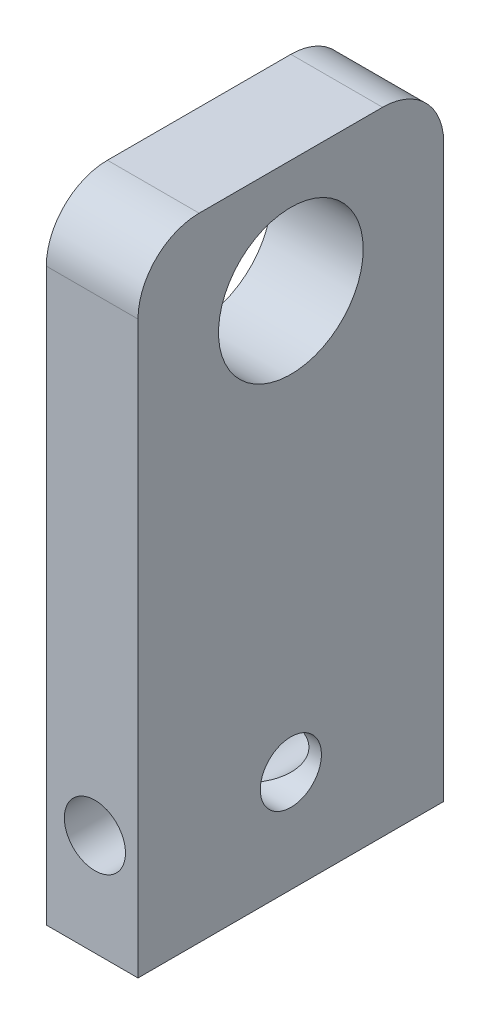
ISO-10303-21;
HEADER;
FILE_DESCRIPTION(('STEP AP214'),'2;1');
FILE_NAME('part.step','',(''),(''),'','','');
FILE_SCHEMA(('AUTOMOTIVE_DESIGN { 1 0 10303 214 1 1 1 1 }'));
ENDSEC;
DATA;
#1=APPLICATION_CONTEXT('core data for automotive mechanical design processes');
#2=APPLICATION_PROTOCOL_DEFINITION('international standard','automotive_design',2000,#1);
#3=PRODUCT_CONTEXT('',#1,'mechanical');
#4=PRODUCT('Part','Part','',(#3));
#5=PRODUCT_RELATED_PRODUCT_CATEGORY('part','',(#4));
#6=PRODUCT_DEFINITION_FORMATION('','',#4);
#7=PRODUCT_DEFINITION_CONTEXT('part definition',#1,'design');
#8=PRODUCT_DEFINITION('design','',#6,#7);
#9=PRODUCT_DEFINITION_SHAPE('','',#8);
#10=(LENGTH_UNIT() NAMED_UNIT(*) SI_UNIT(.MILLI.,.METRE.));
#11=(NAMED_UNIT(*) PLANE_ANGLE_UNIT() SI_UNIT($,.RADIAN.));
#12=(NAMED_UNIT(*) SI_UNIT($,.STERADIAN.) SOLID_ANGLE_UNIT());
#13=UNCERTAINTY_MEASURE_WITH_UNIT(LENGTH_MEASURE(1.E-05),#10,'distance_accuracy_value','');
#14=(GEOMETRIC_REPRESENTATION_CONTEXT(3) GLOBAL_UNCERTAINTY_ASSIGNED_CONTEXT((#13)) GLOBAL_UNIT_ASSIGNED_CONTEXT((#10,
#11,#12)) REPRESENTATION_CONTEXT('',''));
#15=CARTESIAN_POINT('',(0.,0.,0.));
#16=DIRECTION('',(0.,0.,1.));
#17=DIRECTION('',(1.,0.,0.));
#18=AXIS2_PLACEMENT_3D('',#15,#16,#17);
#19=CARTESIAN_POINT('',(17.6136363636364,5.,-6.16363636363637));
#20=DIRECTION('',(-1.,0.,0.));
#21=DIRECTION('',(0.,0.,1.));
#22=AXIS2_PLACEMENT_3D('',#19,#20,#21);
#23=CYLINDRICAL_SURFACE('',#22,1.5);
#24=CARTESIAN_POINT('',(-2.38636363636364,5.,-6.16363636363636));
#25=DIRECTION('',(-1.,0.,0.));
#26=DIRECTION('',(0.,0.,1.));
#27=AXIS2_PLACEMENT_3D('',#24,#25,#26);
#28=CIRCLE('',#27,1.5);
#29=CARTESIAN_POINT('',(-2.38636363636364,5.,-4.66363636363636));
#30=VERTEX_POINT('',#29);
#31=EDGE_CURVE('E166',#30,#30,#28,.T.);
#32=ORIENTED_EDGE('',*,*,#31,.T.);
#33=EDGE_LOOP('',(#32));
#34=FACE_BOUND('',#33,.T.);
#35=CARTESIAN_POINT('',(0.,5.,-6.16363636363636));
#36=DIRECTION('',(-0.707106781186547,0.,0.707106781186547));
#37=DIRECTION('',(-0.707106781186548,0.,-0.707106781186547));
#38=AXIS2_PLACEMENT_3D('',#35,#36,#37);
#39=ELLIPSE('',#38,2.12132034355964,1.5);
#40=CARTESIAN_POINT('',(0.,3.5,-6.16363636363636));
#41=VERTEX_POINT('',#40);
#42=CARTESIAN_POINT('',(0.,6.5,-6.16363636363636));
#43=VERTEX_POINT('',#42);
#44=EDGE_CURVE('E99',#41,#43,#39,.F.);
#45=ORIENTED_EDGE('',*,*,#44,.T.);
#46=CARTESIAN_POINT('',(0.,5.,-6.16363636363636));
#47=DIRECTION('',(-0.707106781186548,0.,-0.707106781186547));
#48=DIRECTION('',(-0.707106781186547,0.,0.707106781186547));
#49=AXIS2_PLACEMENT_3D('',#46,#47,#48);
#50=ELLIPSE('',#49,2.12132034355964,1.5);
#51=EDGE_CURVE('E95',#43,#41,#50,.F.);
#52=ORIENTED_EDGE('',*,*,#51,.T.);
#53=EDGE_LOOP('',(#45,#52));
#54=FACE_BOUND('',#53,.T.);
#55=ADVANCED_FACE('F33',(#34,#54),#23,.F.);
#56=CARTESIAN_POINT('',(-2.38636363636364,31.,-13.6636363636364));
#57=DIRECTION('',(1.,0.,0.));
#58=DIRECTION('',(0.,0.,-1.));
#59=AXIS2_PLACEMENT_3D('',#56,#57,#58);
#60=PLANE('',#59);
#61=ORIENTED_EDGE('',*,*,#31,.F.);
#62=EDGE_LOOP('',(#61));
#63=FACE_BOUND('',#62,.T.);
#64=CARTESIAN_POINT('',(-2.38636363636364,25.45,-6.16363636363636));
#65=DIRECTION('',(1.,0.,0.));
#66=DIRECTION('',(0.,0.,-1.));
#67=AXIS2_PLACEMENT_3D('',#64,#65,#66);
#68=CIRCLE('',#67,3.55);
#69=CARTESIAN_POINT('',(-2.38636363636364,25.45,-9.71363636363636));
#70=VERTEX_POINT('',#69);
#71=EDGE_CURVE('E146',#70,#70,#68,.T.);
#72=ORIENTED_EDGE('',*,*,#71,.T.);
#73=EDGE_LOOP('',(#72));
#74=FACE_BOUND('',#73,.T.);
#75=DIRECTION('',(0.,0.,1.));
#76=VECTOR('',#75,1.);
#77=CARTESIAN_POINT('',(-2.38636363636364,31.,-13.6636363636364));
#78=LINE('',#77,#76);
#79=CARTESIAN_POINT('',(-2.38636363636364,31.,-10.6636363636364));
#80=VERTEX_POINT('',#79);
#81=CARTESIAN_POINT('',(-2.38636363636364,31.,-1.66363636363636));
#82=VERTEX_POINT('',#81);
#83=EDGE_CURVE('E129',#80,#82,#78,.T.);
#84=ORIENTED_EDGE('',*,*,#83,.F.);
#85=CARTESIAN_POINT('',(-2.38636363636364,28.,-10.6636363636364));
#86=DIRECTION('',(1.,0.,0.));
#87=DIRECTION('',(0.,0.,-1.));
#88=AXIS2_PLACEMENT_3D('',#85,#86,#87);
#89=CIRCLE('',#88,3.);
#90=CARTESIAN_POINT('',(-2.38636363636364,28.,-13.6636363636364));
#91=VERTEX_POINT('',#90);
#92=EDGE_CURVE('E55',#80,#91,#89,.F.);
#93=ORIENTED_EDGE('',*,*,#92,.T.);
#94=DIRECTION('',(0.,-1.,0.));
#95=VECTOR('',#94,1.);
#96=CARTESIAN_POINT('',(-2.38636363636364,31.,-13.6636363636364));
#97=LINE('',#96,#95);
#98=CARTESIAN_POINT('',(-2.38636363636364,0.,-13.6636363636364));
#99=VERTEX_POINT('',#98);
#100=EDGE_CURVE('E140',#91,#99,#97,.T.);
#101=ORIENTED_EDGE('',*,*,#100,.T.);
#102=DIRECTION('',(0.,0.,1.));
#103=VECTOR('',#102,1.);
#104=CARTESIAN_POINT('',(-2.38636363636364,0.,-13.6636363636364));
#105=LINE('',#104,#103);
#106=CARTESIAN_POINT('',(-2.38636363636364,0.,1.33636363636364));
#107=VERTEX_POINT('',#106);
#108=EDGE_CURVE('E149',#99,#107,#105,.T.);
#109=ORIENTED_EDGE('',*,*,#108,.T.);
#110=DIRECTION('',(0.,-1.,0.));
#111=VECTOR('',#110,1.);
#112=CARTESIAN_POINT('',(-2.38636363636364,31.,1.33636363636364));
#113=LINE('',#112,#111);
#114=CARTESIAN_POINT('',(-2.38636363636364,28.,1.33636363636364));
#115=VERTEX_POINT('',#114);
#116=EDGE_CURVE('E105',#115,#107,#113,.T.);
#117=ORIENTED_EDGE('',*,*,#116,.F.);
#118=CARTESIAN_POINT('',(-2.38636363636364,28.,-1.66363636363636));
#119=DIRECTION('',(1.,0.,0.));
#120=DIRECTION('',(0.,0.,-1.));
#121=AXIS2_PLACEMENT_3D('',#118,#119,#120);
#122=CIRCLE('',#121,3.);
#123=EDGE_CURVE('E119',#115,#82,#122,.F.);
#124=ORIENTED_EDGE('',*,*,#123,.T.);
#125=EDGE_LOOP('',(#84,#93,#101,#109,#117,#124));
#126=FACE_BOUND('',#125,.T.);
#127=ADVANCED_FACE('F134',(#63,#74,#126),#60,.F.);
#128=CARTESIAN_POINT('',(-2.38636363636364,31.,1.33636363636364));
#129=DIRECTION('',(0.,0.,-1.));
#130=DIRECTION('',(-1.,0.,0.));
#131=AXIS2_PLACEMENT_3D('',#128,#129,#130);
#132=PLANE('',#131);
#133=CARTESIAN_POINT('',(0.,5.,1.33636363636364));
#134=DIRECTION('',(0.,0.,-1.));
#135=DIRECTION('',(-1.,0.,0.));
#136=AXIS2_PLACEMENT_3D('',#133,#134,#135);
#137=CIRCLE('',#136,1.5);
#138=CARTESIAN_POINT('',(-1.5,5.,1.33636363636364));
#139=VERTEX_POINT('',#138);
#140=EDGE_CURVE('E171',#139,#139,#137,.T.);
#141=ORIENTED_EDGE('',*,*,#140,.T.);
#142=EDGE_LOOP('',(#141));
#143=FACE_BOUND('',#142,.T.);
#144=DIRECTION('',(0.,-1.,0.));
#145=VECTOR('',#144,1.);
#146=CARTESIAN_POINT('',(2.11363636363636,31.,1.33636363636364));
#147=LINE('',#146,#145);
#148=CARTESIAN_POINT('',(2.11363636363636,28.,1.33636363636364));
#149=VERTEX_POINT('',#148);
#150=CARTESIAN_POINT('',(2.11363636363636,0.,1.33636363636364));
#151=VERTEX_POINT('',#150);
#152=EDGE_CURVE('E160',#149,#151,#147,.T.);
#153=ORIENTED_EDGE('',*,*,#152,.F.);
#154=DIRECTION('',(1.,0.,0.));
#155=VECTOR('',#154,1.);
#156=CARTESIAN_POINT('',(-2.38636363636364,28.,1.33636363636364));
#157=LINE('',#156,#155);
#158=EDGE_CURVE('E117',#149,#115,#157,.F.);
#159=ORIENTED_EDGE('',*,*,#158,.T.);
#160=ORIENTED_EDGE('',*,*,#116,.T.);
#161=DIRECTION('',(1.,0.,0.));
#162=VECTOR('',#161,1.);
#163=CARTESIAN_POINT('',(-2.38636363636364,0.,1.33636363636364));
#164=LINE('',#163,#162);
#165=EDGE_CURVE('E152',#107,#151,#164,.T.);
#166=ORIENTED_EDGE('',*,*,#165,.T.);
#167=EDGE_LOOP('',(#153,#159,#160,#166));
#168=FACE_BOUND('',#167,.T.);
#169=ADVANCED_FACE('F199',(#143,#168),#132,.F.);
#170=CARTESIAN_POINT('',(2.11363636363636,31.,-13.6636363636364));
#171=DIRECTION('',(-1.,0.,0.));
#172=DIRECTION('',(0.,0.,1.));
#173=AXIS2_PLACEMENT_3D('',#170,#171,#172);
#174=PLANE('',#173);
#175=CARTESIAN_POINT('',(2.11363636363636,5.,-6.16363636363636));
#176=DIRECTION('',(-1.,0.,0.));
#177=DIRECTION('',(0.,0.,1.));
#178=AXIS2_PLACEMENT_3D('',#175,#176,#177);
#179=CIRCLE('',#178,1.5);
#180=CARTESIAN_POINT('',(2.11363636363636,5.,-4.66363636363636));
#181=VERTEX_POINT('',#180);
#182=EDGE_CURVE('E163',#181,#181,#179,.T.);
#183=ORIENTED_EDGE('',*,*,#182,.T.);
#184=EDGE_LOOP('',(#183));
#185=FACE_BOUND('',#184,.T.);
#186=CARTESIAN_POINT('',(2.11363636363636,25.45,-6.16363636363636));
#187=DIRECTION('',(1.,0.,0.));
#188=DIRECTION('',(0.,0.,-1.));
#189=AXIS2_PLACEMENT_3D('',#186,#187,#188);
#190=CIRCLE('',#189,3.55);
#191=CARTESIAN_POINT('',(2.11363636363636,25.45,-9.71363636363636));
#192=VERTEX_POINT('',#191);
#193=EDGE_CURVE('E165',#192,#192,#190,.T.);
#194=ORIENTED_EDGE('',*,*,#193,.F.);
#195=EDGE_LOOP('',(#194));
#196=FACE_BOUND('',#195,.T.);
#197=DIRECTION('',(0.,-1.,0.));
#198=VECTOR('',#197,1.);
#199=CARTESIAN_POINT('',(2.11363636363636,31.,-13.6636363636364));
#200=LINE('',#199,#198);
#201=CARTESIAN_POINT('',(2.11363636363636,28.,-13.6636363636364));
#202=VERTEX_POINT('',#201);
#203=CARTESIAN_POINT('',(2.11363636363636,0.,-13.6636363636364));
#204=VERTEX_POINT('',#203);
#205=EDGE_CURVE('E158',#202,#204,#200,.T.);
#206=ORIENTED_EDGE('',*,*,#205,.F.);
#207=CARTESIAN_POINT('',(2.11363636363636,28.,-10.6636363636364));
#208=DIRECTION('',(-1.,0.,0.));
#209=DIRECTION('',(0.,0.,1.));
#210=AXIS2_PLACEMENT_3D('',#207,#208,#209);
#211=CIRCLE('',#210,3.);
#212=CARTESIAN_POINT('',(2.11363636363636,31.,-10.6636363636364));
#213=VERTEX_POINT('',#212);
#214=EDGE_CURVE('E11',#202,#213,#211,.F.);
#215=ORIENTED_EDGE('',*,*,#214,.T.);
#216=DIRECTION('',(0.,0.,-1.));
#217=VECTOR('',#216,1.);
#218=CARTESIAN_POINT('',(2.11363636363636,31.,-13.6636363636364));
#219=LINE('',#218,#217);
#220=CARTESIAN_POINT('',(2.11363636363636,31.,-1.66363636363636));
#221=VERTEX_POINT('',#220);
#222=EDGE_CURVE('E131',#221,#213,#219,.T.);
#223=ORIENTED_EDGE('',*,*,#222,.F.);
#224=CARTESIAN_POINT('',(2.11363636363636,28.,-1.66363636363636));
#225=DIRECTION('',(-1.,0.,0.));
#226=DIRECTION('',(0.,0.,1.));
#227=AXIS2_PLACEMENT_3D('',#224,#225,#226);
#228=CIRCLE('',#227,3.);
#229=EDGE_CURVE('E115',#221,#149,#228,.F.);
#230=ORIENTED_EDGE('',*,*,#229,.T.);
#231=ORIENTED_EDGE('',*,*,#152,.T.);
#232=DIRECTION('',(0.,0.,-1.));
#233=VECTOR('',#232,1.);
#234=CARTESIAN_POINT('',(2.11363636363636,0.,-13.6636363636364));
#235=LINE('',#234,#233);
#236=EDGE_CURVE('E143',#151,#204,#235,.T.);
#237=ORIENTED_EDGE('',*,*,#236,.T.);
#238=EDGE_LOOP('',(#206,#215,#223,#230,#231,#237));
#239=FACE_BOUND('',#238,.T.);
#240=ADVANCED_FACE('F185',(#185,#196,#239),#174,.F.);
#241=CARTESIAN_POINT('',(-2.38636363636364,31.,-13.6636363636364));
#242=DIRECTION('',(0.,0.,1.));
#243=DIRECTION('',(1.,0.,0.));
#244=AXIS2_PLACEMENT_3D('',#241,#242,#243);
#245=PLANE('',#244);
#246=CARTESIAN_POINT('',(0.,5.,-13.6636363636364));
#247=DIRECTION('',(0.,0.,-1.));
#248=DIRECTION('',(-1.,0.,0.));
#249=AXIS2_PLACEMENT_3D('',#246,#247,#248);
#250=CIRCLE('',#249,1.5);
#251=CARTESIAN_POINT('',(-1.5,5.,-13.6636363636364));
#252=VERTEX_POINT('',#251);
#253=EDGE_CURVE('E176',#252,#252,#250,.T.);
#254=ORIENTED_EDGE('',*,*,#253,.F.);
#255=EDGE_LOOP('',(#254));
#256=FACE_BOUND('',#255,.T.);
#257=ORIENTED_EDGE('',*,*,#100,.F.);
#258=DIRECTION('',(-1.,0.,0.));
#259=VECTOR('',#258,1.);
#260=CARTESIAN_POINT('',(2.11363636363636,28.,-13.6636363636364));
#261=LINE('',#260,#259);
#262=EDGE_CURVE('E41',#91,#202,#261,.F.);
#263=ORIENTED_EDGE('',*,*,#262,.T.);
#264=ORIENTED_EDGE('',*,*,#205,.T.);
#265=DIRECTION('',(-1.,0.,0.));
#266=VECTOR('',#265,1.);
#267=CARTESIAN_POINT('',(-2.38636363636364,0.,-13.6636363636364));
#268=LINE('',#267,#266);
#269=EDGE_CURVE('E138',#204,#99,#268,.T.);
#270=ORIENTED_EDGE('',*,*,#269,.T.);
#271=EDGE_LOOP('',(#257,#263,#264,#270));
#272=FACE_BOUND('',#271,.T.);
#273=ADVANCED_FACE('F183',(#256,#272),#245,.F.);
#274=CARTESIAN_POINT('',(0.,31.,0.));
#275=DIRECTION('',(0.,1.,0.));
#276=DIRECTION('',(0.,0.,1.));
#277=AXIS2_PLACEMENT_3D('',#274,#275,#276);
#278=PLANE('',#277);
#279=ORIENTED_EDGE('',*,*,#222,.T.);
#280=DIRECTION('',(-1.,0.,0.));
#281=VECTOR('',#280,1.);
#282=CARTESIAN_POINT('',(-2.38636363636364,31.,-10.6636363636364));
#283=LINE('',#282,#281);
#284=EDGE_CURVE('E122',#213,#80,#283,.T.);
#285=ORIENTED_EDGE('',*,*,#284,.T.);
#286=ORIENTED_EDGE('',*,*,#83,.T.);
#287=DIRECTION('',(1.,0.,0.));
#288=VECTOR('',#287,1.);
#289=CARTESIAN_POINT('',(2.11363636363636,31.,-1.66363636363636));
#290=LINE('',#289,#288);
#291=EDGE_CURVE('E107',#82,#221,#290,.T.);
#292=ORIENTED_EDGE('',*,*,#291,.T.);
#293=EDGE_LOOP('',(#279,#285,#286,#292));
#294=FACE_BOUND('',#293,.T.);
#295=ADVANCED_FACE('F128',(#294),#278,.T.);
#296=CARTESIAN_POINT('',(0.,0.,0.));
#297=DIRECTION('',(0.,1.,0.));
#298=DIRECTION('',(0.,0.,1.));
#299=AXIS2_PLACEMENT_3D('',#296,#297,#298);
#300=PLANE('',#299);
#301=ORIENTED_EDGE('',*,*,#108,.F.);
#302=ORIENTED_EDGE('',*,*,#269,.F.);
#303=ORIENTED_EDGE('',*,*,#236,.F.);
#304=ORIENTED_EDGE('',*,*,#165,.F.);
#305=EDGE_LOOP('',(#301,#302,#303,#304));
#306=FACE_BOUND('',#305,.T.);
#307=ADVANCED_FACE('F194',(#306),#300,.F.);
#308=CARTESIAN_POINT('',(-17.8863636363636,25.45,-6.16363636363636));
#309=DIRECTION('',(1.,0.,0.));
#310=DIRECTION('',(0.,0.,-1.));
#311=AXIS2_PLACEMENT_3D('',#308,#309,#310);
#312=CYLINDRICAL_SURFACE('',#311,3.55);
#313=ORIENTED_EDGE('',*,*,#193,.T.);
#314=EDGE_LOOP('',(#313));
#315=FACE_BOUND('',#314,.T.);
#316=ORIENTED_EDGE('',*,*,#71,.F.);
#317=EDGE_LOOP('',(#316));
#318=FACE_BOUND('',#317,.T.);
#319=ADVANCED_FACE('F217',(#315,#318),#312,.F.);
#320=CARTESIAN_POINT('',(0.,5.,-6.16363636363636));
#321=DIRECTION('',(-0.707106781186547,0.,0.707106781186547));
#322=DIRECTION('',(-0.707106781186548,0.,-0.707106781186547));
#323=AXIS2_PLACEMENT_3D('',#320,#321,#322);
#324=ELLIPSE('',#323,2.12132034355964,1.5);
#325=EDGE_CURVE('E90',#41,#43,#324,.T.);
#326=ORIENTED_EDGE('',*,*,#325,.T.);
#327=CARTESIAN_POINT('',(0.,5.,-6.16363636363636));
#328=DIRECTION('',(-0.707106781186548,0.,-0.707106781186547));
#329=DIRECTION('',(-0.707106781186547,0.,0.707106781186547));
#330=AXIS2_PLACEMENT_3D('',#327,#328,#329);
#331=ELLIPSE('',#330,2.12132034355964,1.5);
#332=EDGE_CURVE('E98',#43,#41,#331,.T.);
#333=ORIENTED_EDGE('',*,*,#332,.T.);
#334=EDGE_LOOP('',(#326,#333));
#335=FACE_BOUND('',#334,.T.);
#336=ORIENTED_EDGE('',*,*,#182,.F.);
#337=EDGE_LOOP('',(#336));
#338=FACE_BOUND('',#337,.T.);
#339=ADVANCED_FACE('F109',(#335,#338),#23,.F.);
#340=CARTESIAN_POINT('',(0.,5.,6.33636363636364));
#341=DIRECTION('',(0.,0.,-1.));
#342=DIRECTION('',(-1.,0.,0.));
#343=AXIS2_PLACEMENT_3D('',#340,#341,#342);
#344=CYLINDRICAL_SURFACE('',#343,1.5);
#345=ORIENTED_EDGE('',*,*,#253,.T.);
#346=EDGE_LOOP('',(#345));
#347=FACE_BOUND('',#346,.T.);
#348=ORIENTED_EDGE('',*,*,#44,.F.);
#349=ORIENTED_EDGE('',*,*,#332,.F.);
#350=EDGE_LOOP('',(#348,#349));
#351=FACE_BOUND('',#350,.T.);
#352=ADVANCED_FACE('F103',(#347,#351),#344,.F.);
#353=ORIENTED_EDGE('',*,*,#325,.F.);
#354=ORIENTED_EDGE('',*,*,#51,.F.);
#355=EDGE_LOOP('',(#353,#354));
#356=FACE_BOUND('',#355,.T.);
#357=ORIENTED_EDGE('',*,*,#140,.F.);
#358=EDGE_LOOP('',(#357));
#359=FACE_BOUND('',#358,.T.);
#360=ADVANCED_FACE('F92',(#356,#359),#344,.F.);
#361=CARTESIAN_POINT('',(0.,28.,-1.66363636363636));
#362=DIRECTION('',(-1.,0.,0.));
#363=DIRECTION('',(0.,0.,1.));
#364=AXIS2_PLACEMENT_3D('',#361,#362,#363);
#365=CYLINDRICAL_SURFACE('',#364,3.);
#366=ORIENTED_EDGE('',*,*,#123,.F.);
#367=ORIENTED_EDGE('',*,*,#158,.F.);
#368=ORIENTED_EDGE('',*,*,#229,.F.);
#369=ORIENTED_EDGE('',*,*,#291,.F.);
#370=EDGE_LOOP('',(#366,#367,#368,#369));
#371=FACE_BOUND('',#370,.T.);
#372=ADVANCED_FACE('F198',(#371),#365,.T.);
#373=CARTESIAN_POINT('',(0.,28.,-10.6636363636364));
#374=DIRECTION('',(1.,0.,0.));
#375=DIRECTION('',(0.,0.,-1.));
#376=AXIS2_PLACEMENT_3D('',#373,#374,#375);
#377=CYLINDRICAL_SURFACE('',#376,3.);
#378=ORIENTED_EDGE('',*,*,#214,.F.);
#379=ORIENTED_EDGE('',*,*,#262,.F.);
#380=ORIENTED_EDGE('',*,*,#92,.F.);
#381=ORIENTED_EDGE('',*,*,#284,.F.);
#382=EDGE_LOOP('',(#378,#379,#380,#381));
#383=FACE_BOUND('',#382,.T.);
#384=ADVANCED_FACE('F35',(#383),#377,.T.);
#385=CLOSED_SHELL('',(#55,#127,#169,#240,#273,#295,#307,#319,#339,#352,#360,#372,#384));
#386=MANIFOLD_SOLID_BREP('B2',#385);
#387=ADVANCED_BREP_SHAPE_REPRESENTATION('',(#18,#386),#14);
#388=SHAPE_DEFINITION_REPRESENTATION(#9,#387);
ENDSEC;
END-ISO-10303-21;
